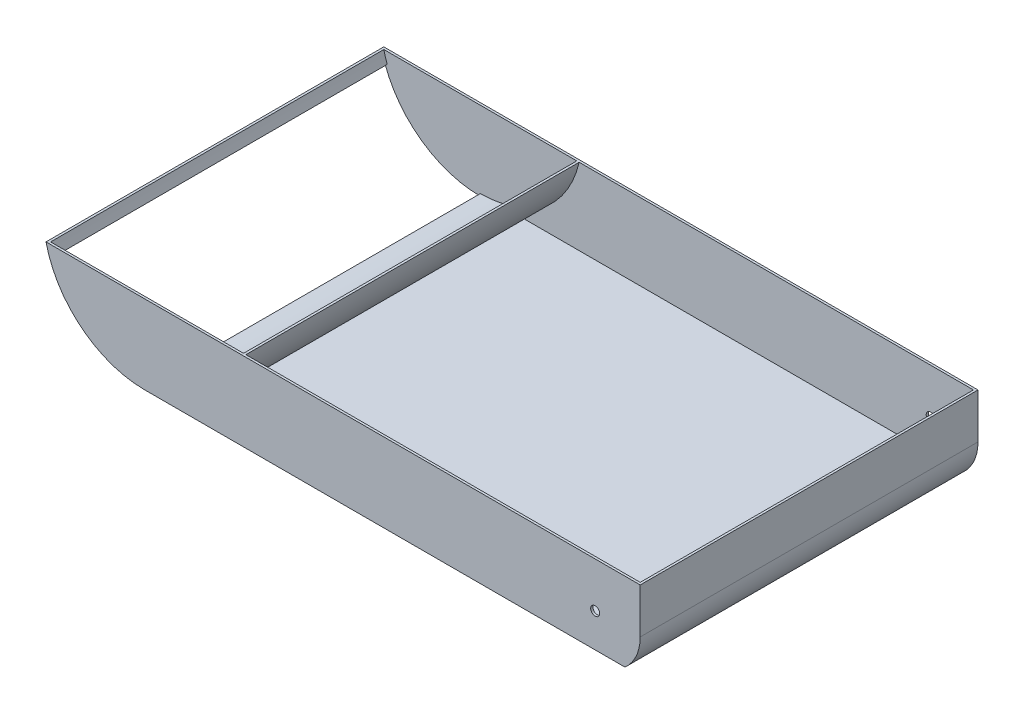
ISO-10303-21;
HEADER;
FILE_DESCRIPTION(('STEP AP214'),'2;1');
FILE_NAME('part.step','',(''),(''),'','','');
FILE_SCHEMA(('AUTOMOTIVE_DESIGN { 1 0 10303 214 1 1 1 1 }'));
ENDSEC;
DATA;
#1=APPLICATION_CONTEXT('core data for automotive mechanical design processes');
#2=APPLICATION_PROTOCOL_DEFINITION('international standard','automotive_design',2000,#1);
#3=PRODUCT_CONTEXT('',#1,'mechanical');
#4=PRODUCT('Part','Part','',(#3));
#5=PRODUCT_RELATED_PRODUCT_CATEGORY('part','',(#4));
#6=PRODUCT_DEFINITION_FORMATION('','',#4);
#7=PRODUCT_DEFINITION_CONTEXT('part definition',#1,'design');
#8=PRODUCT_DEFINITION('design','',#6,#7);
#9=PRODUCT_DEFINITION_SHAPE('','',#8);
#10=(LENGTH_UNIT() NAMED_UNIT(*) SI_UNIT(.MILLI.,.METRE.));
#11=(NAMED_UNIT(*) PLANE_ANGLE_UNIT() SI_UNIT($,.RADIAN.));
#12=(NAMED_UNIT(*) SI_UNIT($,.STERADIAN.) SOLID_ANGLE_UNIT());
#13=UNCERTAINTY_MEASURE_WITH_UNIT(LENGTH_MEASURE(1.E-05),#10,'distance_accuracy_value','');
#14=(GEOMETRIC_REPRESENTATION_CONTEXT(3) GLOBAL_UNCERTAINTY_ASSIGNED_CONTEXT((#13)) GLOBAL_UNIT_ASSIGNED_CONTEXT((#10,
#11,#12)) REPRESENTATION_CONTEXT('',''));
#15=CARTESIAN_POINT('',(0.,0.,0.));
#16=DIRECTION('',(0.,0.,1.));
#17=DIRECTION('',(1.,0.,0.));
#18=AXIS2_PLACEMENT_3D('',#15,#16,#17);
#19=CARTESIAN_POINT('',(400.,-60.,-298.));
#20=DIRECTION('',(0.,0.,1.));
#21=DIRECTION('',(1.,0.,0.));
#22=AXIS2_PLACEMENT_3D('',#19,#20,#21);
#23=PLANE('',#22);
#24=CARTESIAN_POINT('',(0.,0.,-298.));
#25=DIRECTION('',(0.,0.,1.));
#26=DIRECTION('',(1.,0.,0.));
#27=AXIS2_PLACEMENT_3D('',#24,#25,#26);
#28=CIRCLE('',#27,88.);
#29=CARTESIAN_POINT('',(85.6971411425142,-20.,-298.));
#30=VERTEX_POINT('',#29);
#31=CARTESIAN_POINT('',(9.11276629438058E-13,-88.,-298.));
#32=VERTEX_POINT('',#31);
#33=EDGE_CURVE('E59',#30,#32,#28,.F.);
#34=ORIENTED_EDGE('',*,*,#33,.F.);
#35=DIRECTION('',(-1.,0.,0.));
#36=VECTOR('',#35,1.);
#37=CARTESIAN_POINT('',(400.,-20.,-298.));
#38=LINE('',#37,#36);
#39=CARTESIAN_POINT('',(-85.6971411425142,-20.,-298.));
#40=VERTEX_POINT('',#39);
#41=EDGE_CURVE('E221',#30,#40,#38,.T.);
#42=ORIENTED_EDGE('',*,*,#41,.T.);
#43=CARTESIAN_POINT('',(0.,0.,-298.));
#44=DIRECTION('',(0.,0.,1.));
#45=DIRECTION('',(1.,0.,0.));
#46=AXIS2_PLACEMENT_3D('',#43,#44,#45);
#47=CIRCLE('',#46,88.);
#48=CARTESIAN_POINT('',(-82.7284715197857,-30.,-298.));
#49=VERTEX_POINT('',#48);
#50=EDGE_CURVE('E209',#40,#49,#47,.T.);
#51=ORIENTED_EDGE('',*,*,#50,.T.);
#52=DIRECTION('',(-1.,0.,0.));
#53=VECTOR('',#52,1.);
#54=CARTESIAN_POINT('',(0.,-30.,-298.));
#55=LINE('',#54,#53);
#56=CARTESIAN_POINT('',(-84.8528137423857,-30.,-298.));
#57=VERTEX_POINT('',#56);
#58=EDGE_CURVE('E170',#49,#57,#55,.T.);
#59=ORIENTED_EDGE('',*,*,#58,.T.);
#60=CARTESIAN_POINT('',(0.,0.,-298.));
#61=DIRECTION('',(0.,0.,1.));
#62=DIRECTION('',(1.,0.,0.));
#63=AXIS2_PLACEMENT_3D('',#60,#61,#62);
#64=CIRCLE('',#63,90.);
#65=CARTESIAN_POINT('',(9.42699961487646E-13,-90.,-298.));
#66=VERTEX_POINT('',#65);
#67=EDGE_CURVE('E234',#66,#57,#64,.F.);
#68=ORIENTED_EDGE('',*,*,#67,.F.);
#69=DIRECTION('',(0.,1.,0.));
#70=VECTOR('',#69,1.);
#71=CARTESIAN_POINT('',(9.42699961487646E-13,-90.,-298.));
#72=LINE('',#71,#70);
#73=EDGE_CURVE('E309',#66,#32,#72,.T.);
#74=ORIENTED_EDGE('',*,*,#73,.T.);
#75=EDGE_LOOP('',(#34,#42,#51,#59,#68,#74));
#76=FACE_BOUND('',#75,.T.);
#77=ADVANCED_FACE('F41',(#76),#23,.T.);
#78=CARTESIAN_POINT('',(400.,-60.,-2.));
#79=DIRECTION('',(0.,0.,1.));
#80=DIRECTION('',(1.,0.,0.));
#81=AXIS2_PLACEMENT_3D('',#78,#79,#80);
#82=PLANE('',#81);
#83=DIRECTION('',(-1.,0.,0.));
#84=VECTOR('',#83,1.);
#85=CARTESIAN_POINT('',(400.,-20.,-2.));
#86=LINE('',#85,#84);
#87=CARTESIAN_POINT('',(85.6971411425142,-20.,-2.));
#88=VERTEX_POINT('',#87);
#89=CARTESIAN_POINT('',(-85.6971411425142,-20.,-2.));
#90=VERTEX_POINT('',#89);
#91=EDGE_CURVE('E176',#88,#90,#86,.T.);
#92=ORIENTED_EDGE('',*,*,#91,.F.);
#93=CARTESIAN_POINT('',(0.,0.,-2.));
#94=DIRECTION('',(0.,0.,1.));
#95=DIRECTION('',(1.,0.,0.));
#96=AXIS2_PLACEMENT_3D('',#93,#94,#95);
#97=CIRCLE('',#96,88.);
#98=CARTESIAN_POINT('',(0.,-88.,-2.));
#99=VERTEX_POINT('',#98);
#100=EDGE_CURVE('E173',#88,#99,#97,.F.);
#101=ORIENTED_EDGE('',*,*,#100,.T.);
#102=DIRECTION('',(0.,1.,0.));
#103=VECTOR('',#102,1.);
#104=CARTESIAN_POINT('',(9.42699961487646E-13,-90.,-2.));
#105=LINE('',#104,#103);
#106=CARTESIAN_POINT('',(0.,-90.,-2.));
#107=VERTEX_POINT('',#106);
#108=EDGE_CURVE('E158',#107,#99,#105,.T.);
#109=ORIENTED_EDGE('',*,*,#108,.F.);
#110=CARTESIAN_POINT('',(0.,0.,-2.));
#111=DIRECTION('',(0.,0.,1.));
#112=DIRECTION('',(1.,0.,0.));
#113=AXIS2_PLACEMENT_3D('',#110,#111,#112);
#114=CIRCLE('',#113,90.);
#115=CARTESIAN_POINT('',(-84.8528137423857,-30.,-2.));
#116=VERTEX_POINT('',#115);
#117=EDGE_CURVE('E306',#107,#116,#114,.F.);
#118=ORIENTED_EDGE('',*,*,#117,.T.);
#119=DIRECTION('',(-1.,0.,0.));
#120=VECTOR('',#119,1.);
#121=CARTESIAN_POINT('',(0.,-30.,-2.));
#122=LINE('',#121,#120);
#123=CARTESIAN_POINT('',(-82.7284715197857,-30.,-2.));
#124=VERTEX_POINT('',#123);
#125=EDGE_CURVE('E169',#124,#116,#122,.T.);
#126=ORIENTED_EDGE('',*,*,#125,.F.);
#127=CARTESIAN_POINT('',(0.,0.,-2.));
#128=DIRECTION('',(0.,0.,1.));
#129=DIRECTION('',(1.,0.,0.));
#130=AXIS2_PLACEMENT_3D('',#127,#128,#129);
#131=CIRCLE('',#130,88.);
#132=EDGE_CURVE('E210',#90,#124,#131,.T.);
#133=ORIENTED_EDGE('',*,*,#132,.F.);
#134=EDGE_LOOP('',(#92,#101,#109,#118,#126,#133));
#135=FACE_BOUND('',#134,.T.);
#136=ADVANCED_FACE('F174',(#135),#82,.F.);
#137=CARTESIAN_POINT('',(0.,0.,-300.));
#138=DIRECTION('',(0.,0.,1.));
#139=DIRECTION('',(1.,0.,0.));
#140=AXIS2_PLACEMENT_3D('',#137,#138,#139);
#141=CYLINDRICAL_SURFACE('',#140,90.);
#142=DIRECTION('',(0.,0.,1.));
#143=VECTOR('',#142,1.);
#144=CARTESIAN_POINT('',(0.,-90.,-300.));
#145=LINE('',#144,#143);
#146=CARTESIAN_POINT('',(0.,-90.,-300.));
#147=VERTEX_POINT('',#146);
#148=EDGE_CURVE('E11',#147,#66,#145,.T.);
#149=ORIENTED_EDGE('',*,*,#148,.T.);
#150=ORIENTED_EDGE('',*,*,#67,.T.);
#151=DIRECTION('',(0.,0.,1.));
#152=VECTOR('',#151,1.);
#153=CARTESIAN_POINT('',(-84.8528137423857,-30.,-300.));
#154=LINE('',#153,#152);
#155=EDGE_CURVE('E393',#57,#116,#154,.T.);
#156=ORIENTED_EDGE('',*,*,#155,.T.);
#157=ORIENTED_EDGE('',*,*,#117,.F.);
#158=CARTESIAN_POINT('',(0.,-90.,0.));
#159=VERTEX_POINT('',#158);
#160=EDGE_CURVE('E51',#107,#159,#145,.T.);
#161=ORIENTED_EDGE('',*,*,#160,.T.);
#162=CARTESIAN_POINT('',(0.,0.,0.));
#163=DIRECTION('',(0.,0.,1.));
#164=DIRECTION('',(1.,0.,0.));
#165=AXIS2_PLACEMENT_3D('',#162,#163,#164);
#166=CIRCLE('',#165,90.);
#167=CARTESIAN_POINT('',(-87.7496438739212,-20.,0.));
#168=VERTEX_POINT('',#167);
#169=EDGE_CURVE('E271',#168,#159,#166,.T.);
#170=ORIENTED_EDGE('',*,*,#169,.F.);
#171=DIRECTION('',(0.,0.,1.));
#172=VECTOR('',#171,1.);
#173=CARTESIAN_POINT('',(-87.7496438739212,-20.,-300.));
#174=LINE('',#173,#172);
#175=CARTESIAN_POINT('',(-87.7496438739212,-20.,-300.));
#176=VERTEX_POINT('',#175);
#177=EDGE_CURVE('E277',#176,#168,#174,.T.);
#178=ORIENTED_EDGE('',*,*,#177,.F.);
#179=CARTESIAN_POINT('',(0.,0.,-300.));
#180=DIRECTION('',(0.,0.,1.));
#181=DIRECTION('',(1.,0.,0.));
#182=AXIS2_PLACEMENT_3D('',#179,#180,#181);
#183=CIRCLE('',#182,90.);
#184=EDGE_CURVE('E260',#176,#147,#183,.T.);
#185=ORIENTED_EDGE('',*,*,#184,.T.);
#186=EDGE_LOOP('',(#149,#150,#156,#157,#161,#170,#178,#185));
#187=FACE_BOUND('',#186,.T.);
#188=ADVANCED_FACE('F303',(#187),#141,.T.);
#189=CARTESIAN_POINT('',(0.,0.,-300.));
#190=DIRECTION('',(0.,0.,1.));
#191=DIRECTION('',(1.,0.,0.));
#192=AXIS2_PLACEMENT_3D('',#189,#190,#191);
#193=CYLINDRICAL_SURFACE('',#192,88.);
#194=DIRECTION('',(0.,0.,1.));
#195=VECTOR('',#194,1.);
#196=CARTESIAN_POINT('',(-82.7284715197857,-30.,-300.));
#197=LINE('',#196,#195);
#198=EDGE_CURVE('E388',#49,#124,#197,.T.);
#199=ORIENTED_EDGE('',*,*,#198,.F.);
#200=ORIENTED_EDGE('',*,*,#50,.F.);
#201=DIRECTION('',(0.,0.,1.));
#202=VECTOR('',#201,1.);
#203=CARTESIAN_POINT('',(-85.6971411425142,-20.,-298.));
#204=LINE('',#203,#202);
#205=EDGE_CURVE('E186',#40,#90,#204,.T.);
#206=ORIENTED_EDGE('',*,*,#205,.T.);
#207=ORIENTED_EDGE('',*,*,#132,.T.);
#208=EDGE_LOOP('',(#199,#200,#206,#207));
#209=FACE_BOUND('',#208,.T.);
#210=ADVANCED_FACE('F321',(#209),#193,.F.);
#211=CARTESIAN_POINT('',(-22.839294620863,-20.,-300.));
#212=DIRECTION('',(0.,1.,0.));
#213=DIRECTION('',(0.,0.,1.));
#214=AXIS2_PLACEMENT_3D('',#211,#212,#213);
#215=PLANE('',#214);
#216=ORIENTED_EDGE('',*,*,#41,.F.);
#217=DIRECTION('',(0.,0.,1.));
#218=VECTOR('',#217,1.);
#219=CARTESIAN_POINT('',(85.6971411425142,-20.,-412.249721603218));
#220=LINE('',#219,#218);
#221=EDGE_CURVE('E375',#30,#88,#220,.T.);
#222=ORIENTED_EDGE('',*,*,#221,.T.);
#223=ORIENTED_EDGE('',*,*,#91,.T.);
#224=ORIENTED_EDGE('',*,*,#205,.F.);
#225=EDGE_LOOP('',(#216,#222,#223,#224));
#226=FACE_BOUND('',#225,.T.);
#227=CARTESIAN_POINT('',(438.,-20.,-2.));
#228=VERTEX_POINT('',#227);
#229=CARTESIAN_POINT('',(87.7496438739212,-20.,-2.));
#230=VERTEX_POINT('',#229);
#231=EDGE_CURVE('E214',#228,#230,#86,.T.);
#232=ORIENTED_EDGE('',*,*,#231,.T.);
#233=DIRECTION('',(0.,0.,1.));
#234=VECTOR('',#233,1.);
#235=CARTESIAN_POINT('',(87.7496438739212,-20.,-412.249721603218));
#236=LINE('',#235,#234);
#237=CARTESIAN_POINT('',(87.7496438739212,-20.,-298.));
#238=VERTEX_POINT('',#237);
#239=EDGE_CURVE('E405',#238,#230,#236,.T.);
#240=ORIENTED_EDGE('',*,*,#239,.F.);
#241=CARTESIAN_POINT('',(438.,-20.,-298.));
#242=VERTEX_POINT('',#241);
#243=EDGE_CURVE('E67',#242,#238,#38,.T.);
#244=ORIENTED_EDGE('',*,*,#243,.F.);
#245=DIRECTION('',(0.,0.,1.));
#246=VECTOR('',#245,1.);
#247=CARTESIAN_POINT('',(438.,-20.,-300.));
#248=LINE('',#247,#246);
#249=EDGE_CURVE('E194',#242,#228,#248,.T.);
#250=ORIENTED_EDGE('',*,*,#249,.T.);
#251=EDGE_LOOP('',(#232,#240,#244,#250));
#252=FACE_BOUND('',#251,.T.);
#253=ORIENTED_EDGE('',*,*,#177,.T.);
#254=DIRECTION('',(-1.,0.,0.));
#255=VECTOR('',#254,1.);
#256=CARTESIAN_POINT('',(-22.839294620863,-20.,0.));
#257=LINE('',#256,#255);
#258=CARTESIAN_POINT('',(440.,-20.,0.));
#259=VERTEX_POINT('',#258);
#260=EDGE_CURVE('E268',#259,#168,#257,.T.);
#261=ORIENTED_EDGE('',*,*,#260,.F.);
#262=DIRECTION('',(0.,0.,1.));
#263=VECTOR('',#262,1.);
#264=CARTESIAN_POINT('',(440.,-20.,-300.));
#265=LINE('',#264,#263);
#266=CARTESIAN_POINT('',(440.,-20.,-300.));
#267=VERTEX_POINT('',#266);
#268=EDGE_CURVE('E281',#267,#259,#265,.T.);
#269=ORIENTED_EDGE('',*,*,#268,.F.);
#270=DIRECTION('',(-1.,0.,0.));
#271=VECTOR('',#270,1.);
#272=CARTESIAN_POINT('',(440.,-20.,-300.));
#273=LINE('',#272,#271);
#274=EDGE_CURVE('E257',#267,#176,#273,.T.);
#275=ORIENTED_EDGE('',*,*,#274,.T.);
#276=EDGE_LOOP('',(#253,#261,#269,#275));
#277=FACE_BOUND('',#276,.T.);
#278=ADVANCED_FACE('F319',(#226,#252,#277),#215,.T.);
#279=CARTESIAN_POINT('',(0.,-90.,-300.));
#280=DIRECTION('',(0.,-1.,0.));
#281=DIRECTION('',(1.,0.,0.));
#282=AXIS2_PLACEMENT_3D('',#279,#280,#281);
#283=PLANE('',#282);
#284=DIRECTION('',(1.,0.,0.));
#285=VECTOR('',#284,1.);
#286=CARTESIAN_POINT('',(0.,-90.,0.));
#287=LINE('',#286,#285);
#288=CARTESIAN_POINT('',(426.457513110646,-90.,0.));
#289=VERTEX_POINT('',#288);
#290=EDGE_CURVE('E249',#159,#289,#287,.T.);
#291=ORIENTED_EDGE('',*,*,#290,.F.);
#292=ORIENTED_EDGE('',*,*,#160,.F.);
#293=DIRECTION('',(0.,0.,-1.));
#294=VECTOR('',#293,1.);
#295=CARTESIAN_POINT('',(9.42699961487646E-13,-90.,115.659445015524));
#296=LINE('',#295,#294);
#297=EDGE_CURVE('E165',#107,#66,#296,.T.);
#298=ORIENTED_EDGE('',*,*,#297,.T.);
#299=ORIENTED_EDGE('',*,*,#148,.F.);
#300=DIRECTION('',(1.,0.,0.));
#301=VECTOR('',#300,1.);
#302=CARTESIAN_POINT('',(400.,-90.,-300.));
#303=LINE('',#302,#301);
#304=CARTESIAN_POINT('',(426.457513110646,-90.,-300.));
#305=VERTEX_POINT('',#304);
#306=EDGE_CURVE('E244',#147,#305,#303,.T.);
#307=ORIENTED_EDGE('',*,*,#306,.T.);
#308=DIRECTION('',(0.,0.,1.));
#309=VECTOR('',#308,1.);
#310=CARTESIAN_POINT('',(426.457513110646,-90.,-300.));
#311=LINE('',#310,#309);
#312=EDGE_CURVE('E263',#305,#289,#311,.T.);
#313=ORIENTED_EDGE('',*,*,#312,.T.);
#314=EDGE_LOOP('',(#291,#292,#298,#299,#307,#313));
#315=FACE_BOUND('',#314,.T.);
#316=ADVANCED_FACE('F292',(#315),#283,.T.);
#317=CARTESIAN_POINT('',(440.,-60.,-300.));
#318=DIRECTION('',(1.,0.,0.));
#319=DIRECTION('',(0.,0.,-1.));
#320=AXIS2_PLACEMENT_3D('',#317,#318,#319);
#321=PLANE('',#320);
#322=DIRECTION('',(0.,1.,0.));
#323=VECTOR('',#322,1.);
#324=CARTESIAN_POINT('',(440.,-60.,0.));
#325=LINE('',#324,#323);
#326=CARTESIAN_POINT('',(440.,-60.,0.));
#327=VERTEX_POINT('',#326);
#328=EDGE_CURVE('E191',#327,#259,#325,.T.);
#329=ORIENTED_EDGE('',*,*,#328,.F.);
#330=DIRECTION('',(0.,0.,1.));
#331=VECTOR('',#330,1.);
#332=CARTESIAN_POINT('',(440.,-60.,-300.));
#333=LINE('',#332,#331);
#334=CARTESIAN_POINT('',(440.,-60.,-300.));
#335=VERTEX_POINT('',#334);
#336=EDGE_CURVE('E285',#335,#327,#333,.T.);
#337=ORIENTED_EDGE('',*,*,#336,.F.);
#338=DIRECTION('',(0.,1.,0.));
#339=VECTOR('',#338,1.);
#340=CARTESIAN_POINT('',(440.,-60.,-300.));
#341=LINE('',#340,#339);
#342=EDGE_CURVE('E253',#335,#267,#341,.T.);
#343=ORIENTED_EDGE('',*,*,#342,.T.);
#344=ORIENTED_EDGE('',*,*,#268,.T.);
#345=EDGE_LOOP('',(#329,#337,#343,#344));
#346=FACE_BOUND('',#345,.T.);
#347=ADVANCED_FACE('F317',(#346),#321,.T.);
#348=CARTESIAN_POINT('',(400.,-60.,-300.));
#349=DIRECTION('',(0.,0.,1.));
#350=DIRECTION('',(1.,0.,0.));
#351=AXIS2_PLACEMENT_3D('',#348,#349,#350);
#352=CYLINDRICAL_SURFACE('',#351,40.);
#353=CARTESIAN_POINT('',(400.,-60.,0.));
#354=DIRECTION('',(0.,0.,1.));
#355=DIRECTION('',(1.,0.,0.));
#356=AXIS2_PLACEMENT_3D('',#353,#354,#355);
#357=CIRCLE('',#356,40.);
#358=EDGE_CURVE('E185',#289,#327,#357,.T.);
#359=ORIENTED_EDGE('',*,*,#358,.F.);
#360=ORIENTED_EDGE('',*,*,#312,.F.);
#361=CARTESIAN_POINT('',(400.,-60.,-300.));
#362=DIRECTION('',(0.,0.,1.));
#363=DIRECTION('',(1.,0.,0.));
#364=AXIS2_PLACEMENT_3D('',#361,#362,#363);
#365=CIRCLE('',#364,40.);
#366=EDGE_CURVE('E248',#305,#335,#365,.T.);
#367=ORIENTED_EDGE('',*,*,#366,.T.);
#368=ORIENTED_EDGE('',*,*,#336,.T.);
#369=EDGE_LOOP('',(#359,#360,#367,#368));
#370=FACE_BOUND('',#369,.T.);
#371=ADVANCED_FACE('F43',(#370),#352,.T.);
#372=CARTESIAN_POINT('',(400.,-60.,-300.));
#373=DIRECTION('',(0.,0.,1.));
#374=DIRECTION('',(1.,0.,0.));
#375=AXIS2_PLACEMENT_3D('',#372,#373,#374);
#376=PLANE('',#375);
#377=CARTESIAN_POINT('',(400.,-60.,-300.));
#378=DIRECTION('',(0.,0.,1.));
#379=DIRECTION('',(1.,0.,0.));
#380=AXIS2_PLACEMENT_3D('',#377,#378,#379);
#381=CIRCLE('',#380,3.99999999999999);
#382=CARTESIAN_POINT('',(404.,-60.,-300.));
#383=VERTEX_POINT('',#382);
#384=EDGE_CURVE('E415',#383,#383,#381,.T.);
#385=ORIENTED_EDGE('',*,*,#384,.T.);
#386=EDGE_LOOP('',(#385));
#387=FACE_BOUND('',#386,.T.);
#388=ORIENTED_EDGE('',*,*,#306,.F.);
#389=ORIENTED_EDGE('',*,*,#184,.F.);
#390=ORIENTED_EDGE('',*,*,#274,.F.);
#391=ORIENTED_EDGE('',*,*,#342,.F.);
#392=ORIENTED_EDGE('',*,*,#366,.F.);
#393=EDGE_LOOP('',(#388,#389,#390,#391,#392));
#394=FACE_BOUND('',#393,.T.);
#395=ADVANCED_FACE('F314',(#387,#394),#376,.F.);
#396=CARTESIAN_POINT('',(400.,-60.,0.));
#397=DIRECTION('',(0.,0.,1.));
#398=DIRECTION('',(1.,0.,0.));
#399=AXIS2_PLACEMENT_3D('',#396,#397,#398);
#400=PLANE('',#399);
#401=CARTESIAN_POINT('',(400.,-60.,0.));
#402=DIRECTION('',(0.,0.,1.));
#403=DIRECTION('',(1.,0.,0.));
#404=AXIS2_PLACEMENT_3D('',#401,#402,#403);
#405=CIRCLE('',#404,3.99999999999999);
#406=CARTESIAN_POINT('',(404.,-60.,0.));
#407=VERTEX_POINT('',#406);
#408=EDGE_CURVE('E411',#407,#407,#405,.T.);
#409=ORIENTED_EDGE('',*,*,#408,.F.);
#410=EDGE_LOOP('',(#409));
#411=FACE_BOUND('',#410,.T.);
#412=ORIENTED_EDGE('',*,*,#260,.T.);
#413=ORIENTED_EDGE('',*,*,#169,.T.);
#414=ORIENTED_EDGE('',*,*,#290,.T.);
#415=ORIENTED_EDGE('',*,*,#358,.T.);
#416=ORIENTED_EDGE('',*,*,#328,.T.);
#417=EDGE_LOOP('',(#412,#413,#414,#415,#416));
#418=FACE_BOUND('',#417,.T.);
#419=ADVANCED_FACE('F299',(#411,#418),#400,.T.);
#420=CARTESIAN_POINT('',(0.,-88.,-300.));
#421=DIRECTION('',(0.,-1.,0.));
#422=DIRECTION('',(1.,0.,0.));
#423=AXIS2_PLACEMENT_3D('',#420,#421,#422);
#424=PLANE('',#423);
#425=DIRECTION('',(1.,0.,0.));
#426=VECTOR('',#425,1.);
#427=CARTESIAN_POINT('',(400.,-88.,-298.));
#428=LINE('',#427,#426);
#429=CARTESIAN_POINT('',(18.8679622641132,-88.,-298.));
#430=VERTEX_POINT('',#429);
#431=CARTESIAN_POINT('',(425.69046515733,-88.,-298.));
#432=VERTEX_POINT('',#431);
#433=EDGE_CURVE('E200',#430,#432,#428,.T.);
#434=ORIENTED_EDGE('',*,*,#433,.F.);
#435=DIRECTION('',(0.,0.,1.));
#436=VECTOR('',#435,1.);
#437=CARTESIAN_POINT('',(18.8679622641132,-88.,-412.249721603218));
#438=LINE('',#437,#436);
#439=CARTESIAN_POINT('',(18.8679622641132,-88.,-2.));
#440=VERTEX_POINT('',#439);
#441=EDGE_CURVE('E363',#430,#440,#438,.T.);
#442=ORIENTED_EDGE('',*,*,#441,.T.);
#443=DIRECTION('',(1.,0.,0.));
#444=VECTOR('',#443,1.);
#445=CARTESIAN_POINT('',(400.,-88.,-2.));
#446=LINE('',#445,#444);
#447=CARTESIAN_POINT('',(425.69046515733,-88.,-2.));
#448=VERTEX_POINT('',#447);
#449=EDGE_CURVE('E198',#440,#448,#446,.T.);
#450=ORIENTED_EDGE('',*,*,#449,.T.);
#451=DIRECTION('',(0.,0.,1.));
#452=VECTOR('',#451,1.);
#453=CARTESIAN_POINT('',(425.69046515733,-88.,-298.));
#454=LINE('',#453,#452);
#455=EDGE_CURVE('E204',#432,#448,#454,.T.);
#456=ORIENTED_EDGE('',*,*,#455,.F.);
#457=EDGE_LOOP('',(#434,#442,#450,#456));
#458=FACE_BOUND('',#457,.T.);
#459=ADVANCED_FACE('F366',(#458),#424,.F.);
#460=CARTESIAN_POINT('',(438.,-60.,-300.));
#461=DIRECTION('',(1.,0.,0.));
#462=DIRECTION('',(0.,0.,-1.));
#463=AXIS2_PLACEMENT_3D('',#460,#461,#462);
#464=PLANE('',#463);
#465=DIRECTION('',(0.,1.,0.));
#466=VECTOR('',#465,1.);
#467=CARTESIAN_POINT('',(438.,-60.,-2.));
#468=LINE('',#467,#466);
#469=CARTESIAN_POINT('',(438.,-60.,-2.));
#470=VERTEX_POINT('',#469);
#471=EDGE_CURVE('E225',#470,#228,#468,.T.);
#472=ORIENTED_EDGE('',*,*,#471,.T.);
#473=ORIENTED_EDGE('',*,*,#249,.F.);
#474=DIRECTION('',(0.,1.,0.));
#475=VECTOR('',#474,1.);
#476=CARTESIAN_POINT('',(438.,-60.,-298.));
#477=LINE('',#476,#475);
#478=CARTESIAN_POINT('',(438.,-60.,-298.));
#479=VERTEX_POINT('',#478);
#480=EDGE_CURVE('E218',#479,#242,#477,.T.);
#481=ORIENTED_EDGE('',*,*,#480,.F.);
#482=DIRECTION('',(0.,0.,1.));
#483=VECTOR('',#482,1.);
#484=CARTESIAN_POINT('',(438.,-60.,-300.));
#485=LINE('',#484,#483);
#486=EDGE_CURVE('E208',#479,#470,#485,.T.);
#487=ORIENTED_EDGE('',*,*,#486,.T.);
#488=EDGE_LOOP('',(#472,#473,#481,#487));
#489=FACE_BOUND('',#488,.T.);
#490=ADVANCED_FACE('F351',(#489),#464,.F.);
#491=CARTESIAN_POINT('',(400.,-60.,-300.));
#492=DIRECTION('',(0.,0.,1.));
#493=DIRECTION('',(1.,0.,0.));
#494=AXIS2_PLACEMENT_3D('',#491,#492,#493);
#495=CYLINDRICAL_SURFACE('',#494,38.);
#496=CARTESIAN_POINT('',(400.,-60.,-2.));
#497=DIRECTION('',(0.,0.,1.));
#498=DIRECTION('',(1.,0.,0.));
#499=AXIS2_PLACEMENT_3D('',#496,#497,#498);
#500=CIRCLE('',#499,38.);
#501=EDGE_CURVE('E229',#448,#470,#500,.T.);
#502=ORIENTED_EDGE('',*,*,#501,.T.);
#503=ORIENTED_EDGE('',*,*,#486,.F.);
#504=CARTESIAN_POINT('',(400.,-60.,-298.));
#505=DIRECTION('',(0.,0.,1.));
#506=DIRECTION('',(1.,0.,0.));
#507=AXIS2_PLACEMENT_3D('',#504,#505,#506);
#508=CIRCLE('',#507,38.);
#509=EDGE_CURVE('E203',#432,#479,#508,.T.);
#510=ORIENTED_EDGE('',*,*,#509,.F.);
#511=ORIENTED_EDGE('',*,*,#455,.T.);
#512=EDGE_LOOP('',(#502,#503,#510,#511));
#513=FACE_BOUND('',#512,.T.);
#514=ADVANCED_FACE('F344',(#513),#495,.F.);
#515=CARTESIAN_POINT('',(400.,-60.,-298.));
#516=DIRECTION('',(0.,0.,1.));
#517=DIRECTION('',(1.,0.,0.));
#518=AXIS2_PLACEMENT_3D('',#515,#516,#517);
#519=CIRCLE('',#518,3.99999999999999);
#520=CARTESIAN_POINT('',(404.,-60.,-298.));
#521=VERTEX_POINT('',#520);
#522=EDGE_CURVE('E355',#521,#521,#519,.T.);
#523=ORIENTED_EDGE('',*,*,#522,.F.);
#524=EDGE_LOOP('',(#523));
#525=FACE_BOUND('',#524,.T.);
#526=CARTESIAN_POINT('',(0.,0.,-298.));
#527=DIRECTION('',(0.,0.,1.));
#528=DIRECTION('',(1.,0.,0.));
#529=AXIS2_PLACEMENT_3D('',#526,#527,#528);
#530=CIRCLE('',#529,90.);
#531=EDGE_CURVE('E181',#430,#238,#530,.T.);
#532=ORIENTED_EDGE('',*,*,#531,.F.);
#533=ORIENTED_EDGE('',*,*,#433,.T.);
#534=ORIENTED_EDGE('',*,*,#509,.T.);
#535=ORIENTED_EDGE('',*,*,#480,.T.);
#536=ORIENTED_EDGE('',*,*,#243,.T.);
#537=EDGE_LOOP('',(#532,#533,#534,#535,#536));
#538=FACE_BOUND('',#537,.T.);
#539=ADVANCED_FACE('F337',(#525,#538),#23,.T.);
#540=CARTESIAN_POINT('',(400.,-60.,-2.));
#541=DIRECTION('',(0.,0.,1.));
#542=DIRECTION('',(1.,0.,0.));
#543=AXIS2_PLACEMENT_3D('',#540,#541,#542);
#544=CIRCLE('',#543,3.99999999999999);
#545=CARTESIAN_POINT('',(404.,-60.,-2.));
#546=VERTEX_POINT('',#545);
#547=EDGE_CURVE('E45',#546,#546,#544,.T.);
#548=ORIENTED_EDGE('',*,*,#547,.T.);
#549=EDGE_LOOP('',(#548));
#550=FACE_BOUND('',#549,.T.);
#551=ORIENTED_EDGE('',*,*,#449,.F.);
#552=CARTESIAN_POINT('',(0.,0.,-2.));
#553=DIRECTION('',(0.,0.,1.));
#554=DIRECTION('',(1.,0.,0.));
#555=AXIS2_PLACEMENT_3D('',#552,#553,#554);
#556=CIRCLE('',#555,90.);
#557=EDGE_CURVE('E371',#440,#230,#556,.T.);
#558=ORIENTED_EDGE('',*,*,#557,.T.);
#559=ORIENTED_EDGE('',*,*,#231,.F.);
#560=ORIENTED_EDGE('',*,*,#471,.F.);
#561=ORIENTED_EDGE('',*,*,#501,.F.);
#562=EDGE_LOOP('',(#551,#558,#559,#560,#561));
#563=FACE_BOUND('',#562,.T.);
#564=ADVANCED_FACE('F342',(#550,#563),#82,.F.);
#565=CARTESIAN_POINT('',(9.42699961487646E-13,-90.,115.659445015524));
#566=DIRECTION('',(-1.,0.,0.));
#567=DIRECTION('',(0.,-1.,0.));
#568=AXIS2_PLACEMENT_3D('',#565,#566,#567);
#569=PLANE('',#568);
#570=DIRECTION('',(0.,0.,1.));
#571=VECTOR('',#570,1.);
#572=CARTESIAN_POINT('',(0.,-88.,-300.));
#573=LINE('',#572,#571);
#574=EDGE_CURVE('E163',#32,#99,#573,.T.);
#575=ORIENTED_EDGE('',*,*,#574,.F.);
#576=ORIENTED_EDGE('',*,*,#73,.F.);
#577=ORIENTED_EDGE('',*,*,#297,.F.);
#578=ORIENTED_EDGE('',*,*,#108,.T.);
#579=EDGE_LOOP('',(#575,#576,#577,#578));
#580=FACE_BOUND('',#579,.T.);
#581=ADVANCED_FACE('F160',(#580),#569,.T.);
#582=CARTESIAN_POINT('',(0.,-30.,115.659445015524));
#583=DIRECTION('',(0.,-1.,0.));
#584=DIRECTION('',(1.,0.,0.));
#585=AXIS2_PLACEMENT_3D('',#582,#583,#584);
#586=PLANE('',#585);
#587=ORIENTED_EDGE('',*,*,#58,.F.);
#588=ORIENTED_EDGE('',*,*,#198,.T.);
#589=ORIENTED_EDGE('',*,*,#125,.T.);
#590=ORIENTED_EDGE('',*,*,#155,.F.);
#591=EDGE_LOOP('',(#587,#588,#589,#590));
#592=FACE_BOUND('',#591,.T.);
#593=ADVANCED_FACE('F439',(#592),#586,.T.);
#594=CARTESIAN_POINT('',(0.,0.,-412.249721603218));
#595=DIRECTION('',(0.,0.,1.));
#596=DIRECTION('',(1.,0.,0.));
#597=AXIS2_PLACEMENT_3D('',#594,#595,#596);
#598=CYLINDRICAL_SURFACE('',#597,88.);
#599=ORIENTED_EDGE('',*,*,#221,.F.);
#600=ORIENTED_EDGE('',*,*,#33,.T.);
#601=ORIENTED_EDGE('',*,*,#574,.T.);
#602=ORIENTED_EDGE('',*,*,#100,.F.);
#603=EDGE_LOOP('',(#599,#600,#601,#602));
#604=FACE_BOUND('',#603,.T.);
#605=ADVANCED_FACE('F183',(#604),#598,.F.);
#606=CARTESIAN_POINT('',(0.,0.,-412.249721603218));
#607=DIRECTION('',(0.,0.,1.));
#608=DIRECTION('',(1.,0.,0.));
#609=AXIS2_PLACEMENT_3D('',#606,#607,#608);
#610=CYLINDRICAL_SURFACE('',#609,90.);
#611=ORIENTED_EDGE('',*,*,#441,.F.);
#612=ORIENTED_EDGE('',*,*,#531,.T.);
#613=ORIENTED_EDGE('',*,*,#239,.T.);
#614=ORIENTED_EDGE('',*,*,#557,.F.);
#615=EDGE_LOOP('',(#611,#612,#613,#614));
#616=FACE_BOUND('',#615,.T.);
#617=ADVANCED_FACE('F370',(#616),#610,.T.);
#618=CARTESIAN_POINT('',(400.,-60.,-300.));
#619=DIRECTION('',(0.,0.,1.));
#620=DIRECTION('',(1.,0.,0.));
#621=AXIS2_PLACEMENT_3D('',#618,#619,#620);
#622=CYLINDRICAL_SURFACE('',#621,3.99999999999999);
#623=ORIENTED_EDGE('',*,*,#408,.T.);
#624=EDGE_LOOP('',(#623));
#625=FACE_BOUND('',#624,.T.);
#626=ORIENTED_EDGE('',*,*,#547,.F.);
#627=EDGE_LOOP('',(#626));
#628=FACE_BOUND('',#627,.T.);
#629=ADVANCED_FACE('F425',(#625,#628),#622,.F.);
#630=ORIENTED_EDGE('',*,*,#522,.T.);
#631=EDGE_LOOP('',(#630));
#632=FACE_BOUND('',#631,.T.);
#633=ORIENTED_EDGE('',*,*,#384,.F.);
#634=EDGE_LOOP('',(#633));
#635=FACE_BOUND('',#634,.T.);
#636=ADVANCED_FACE('F427',(#632,#635),#622,.F.);
#637=CLOSED_SHELL('',(#77,#136,#188,#210,#278,#316,#347,#371,#395,#419,#459,#490,#514,#539,#564,
#581,#593,#605,#617,#629,#636));
#638=MANIFOLD_SOLID_BREP('B2',#637);
#639=ADVANCED_BREP_SHAPE_REPRESENTATION('',(#18,#638),#14);
#640=SHAPE_DEFINITION_REPRESENTATION(#9,#639);
ENDSEC;
END-ISO-10303-21;
